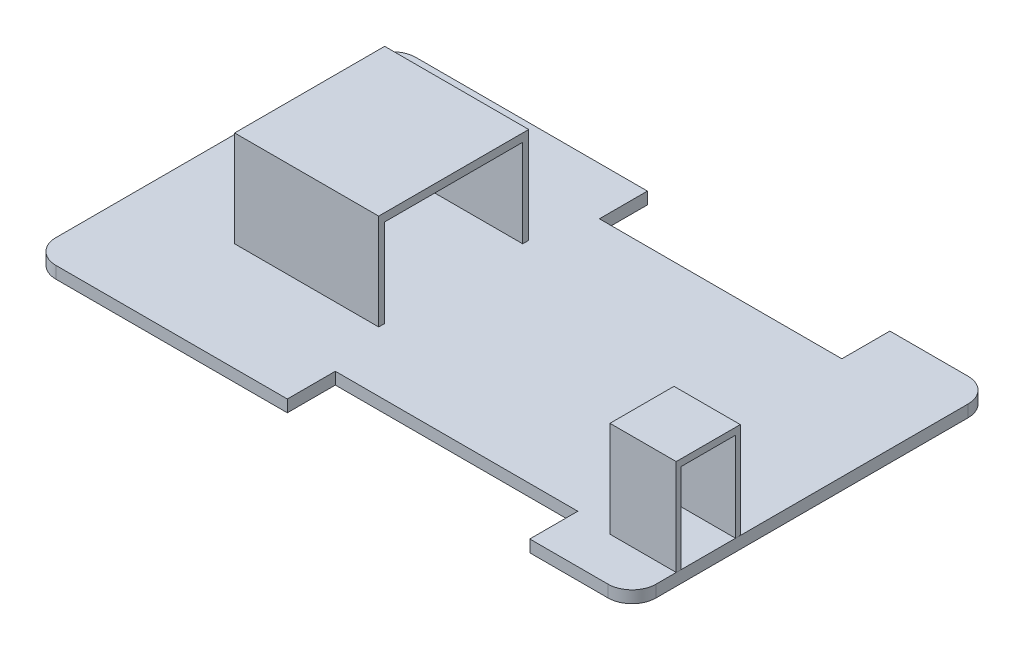
ISO-10303-21;
HEADER;
FILE_DESCRIPTION(('STEP AP214'),'2;1');
FILE_NAME('part.step','',(''),(''),'','','');
FILE_SCHEMA(('AUTOMOTIVE_DESIGN { 1 0 10303 214 1 1 1 1 }'));
ENDSEC;
DATA;
#1=APPLICATION_CONTEXT('core data for automotive mechanical design processes');
#2=APPLICATION_PROTOCOL_DEFINITION('international standard','automotive_design',2000,#1);
#3=PRODUCT_CONTEXT('',#1,'mechanical');
#4=PRODUCT('Part','Part','',(#3));
#5=PRODUCT_RELATED_PRODUCT_CATEGORY('part','',(#4));
#6=PRODUCT_DEFINITION_FORMATION('','',#4);
#7=PRODUCT_DEFINITION_CONTEXT('part definition',#1,'design');
#8=PRODUCT_DEFINITION('design','',#6,#7);
#9=PRODUCT_DEFINITION_SHAPE('','',#8);
#10=(LENGTH_UNIT() NAMED_UNIT(*) SI_UNIT(.MILLI.,.METRE.));
#11=(NAMED_UNIT(*) PLANE_ANGLE_UNIT() SI_UNIT($,.RADIAN.));
#12=(NAMED_UNIT(*) SI_UNIT($,.STERADIAN.) SOLID_ANGLE_UNIT());
#13=UNCERTAINTY_MEASURE_WITH_UNIT(LENGTH_MEASURE(1.E-05),#10,'distance_accuracy_value','');
#14=(GEOMETRIC_REPRESENTATION_CONTEXT(3) GLOBAL_UNCERTAINTY_ASSIGNED_CONTEXT((#13)) GLOBAL_UNIT_ASSIGNED_CONTEXT((#10,
#11,#12)) REPRESENTATION_CONTEXT('',''));
#15=CARTESIAN_POINT('',(0.,0.,0.));
#16=DIRECTION('',(0.,0.,1.));
#17=DIRECTION('',(1.,0.,0.));
#18=AXIS2_PLACEMENT_3D('',#15,#16,#17);
#19=CARTESIAN_POINT('',(99.4609846046097,45.,-47.5));
#20=DIRECTION('',(0.,0.,1.));
#21=DIRECTION('',(1.,0.,0.));
#22=AXIS2_PLACEMENT_3D('',#19,#20,#21);
#23=PLANE('',#22);
#24=DIRECTION('',(-1.,0.,0.));
#25=VECTOR('',#24,1.);
#26=CARTESIAN_POINT('',(99.4609846046097,41.6403706407777,-47.5));
#27=LINE('',#26,#25);
#28=CARTESIAN_POINT('',(99.4609846046097,41.6403706407777,-47.5));
#29=VERTEX_POINT('',#28);
#30=CARTESIAN_POINT('',(39.4609846046098,41.6403706407777,-47.5));
#31=VERTEX_POINT('',#30);
#32=EDGE_CURVE('E259',#29,#31,#27,.T.);
#33=ORIENTED_EDGE('',*,*,#32,.F.);
#34=DIRECTION('',(0.,-1.,0.));
#35=VECTOR('',#34,1.);
#36=CARTESIAN_POINT('',(99.4609846046097,45.,-47.5));
#37=LINE('',#36,#35);
#38=CARTESIAN_POINT('',(99.4609846046097,5.,-47.5));
#39=VERTEX_POINT('',#38);
#40=EDGE_CURVE('E268',#29,#39,#37,.T.);
#41=ORIENTED_EDGE('',*,*,#40,.T.);
#42=DIRECTION('',(-1.,0.,0.));
#43=VECTOR('',#42,1.);
#44=CARTESIAN_POINT('',(99.4609846046097,5.,-47.5));
#45=LINE('',#44,#43);
#46=CARTESIAN_POINT('',(39.4609846046098,5.,-47.5));
#47=VERTEX_POINT('',#46);
#48=EDGE_CURVE('E267',#39,#47,#45,.T.);
#49=ORIENTED_EDGE('',*,*,#48,.T.);
#50=DIRECTION('',(0.,-1.,0.));
#51=VECTOR('',#50,1.);
#52=CARTESIAN_POINT('',(39.4609846046098,45.,-47.5));
#53=LINE('',#52,#51);
#54=EDGE_CURVE('E248',#31,#47,#53,.T.);
#55=ORIENTED_EDGE('',*,*,#54,.F.);
#56=EDGE_LOOP('',(#33,#41,#49,#55));
#57=FACE_BOUND('',#56,.T.);
#58=ADVANCED_FACE('F33',(#57),#23,.F.);
#59=CARTESIAN_POINT('',(99.4609846046097,45.,-105.));
#60=DIRECTION('',(0.,0.,-1.));
#61=DIRECTION('',(-1.,0.,0.));
#62=AXIS2_PLACEMENT_3D('',#59,#60,#61);
#63=PLANE('',#62);
#64=DIRECTION('',(-1.,0.,0.));
#65=VECTOR('',#64,1.);
#66=CARTESIAN_POINT('',(99.4609846046097,41.6403706407777,-105.));
#67=LINE('',#66,#65);
#68=CARTESIAN_POINT('',(99.4609846046097,41.6403706407777,-105.));
#69=VERTEX_POINT('',#68);
#70=CARTESIAN_POINT('',(39.4609846046098,41.6403706407777,-105.));
#71=VERTEX_POINT('',#70);
#72=EDGE_CURVE('E256',#69,#71,#67,.T.);
#73=ORIENTED_EDGE('',*,*,#72,.T.);
#74=DIRECTION('',(0.,-1.,0.));
#75=VECTOR('',#74,1.);
#76=CARTESIAN_POINT('',(39.4609846046098,45.,-105.));
#77=LINE('',#76,#75);
#78=CARTESIAN_POINT('',(39.4609846046098,5.,-105.));
#79=VERTEX_POINT('',#78);
#80=EDGE_CURVE('E251',#71,#79,#77,.T.);
#81=ORIENTED_EDGE('',*,*,#80,.T.);
#82=DIRECTION('',(1.,0.,0.));
#83=VECTOR('',#82,1.);
#84=CARTESIAN_POINT('',(99.4609846046097,5.,-105.));
#85=LINE('',#84,#83);
#86=CARTESIAN_POINT('',(99.4609846046097,5.,-105.));
#87=VERTEX_POINT('',#86);
#88=EDGE_CURVE('E645',#79,#87,#85,.T.);
#89=ORIENTED_EDGE('',*,*,#88,.T.);
#90=DIRECTION('',(0.,-1.,0.));
#91=VECTOR('',#90,1.);
#92=CARTESIAN_POINT('',(99.4609846046097,45.,-105.));
#93=LINE('',#92,#91);
#94=EDGE_CURVE('E642',#69,#87,#93,.T.);
#95=ORIENTED_EDGE('',*,*,#94,.F.);
#96=EDGE_LOOP('',(#73,#81,#89,#95));
#97=FACE_BOUND('',#96,.T.);
#98=ADVANCED_FACE('F472',(#97),#63,.F.);
#99=CARTESIAN_POINT('',(249.98195246404,45.,-20.4156335925063));
#100=DIRECTION('',(0.,0.,1.));
#101=DIRECTION('',(1.,0.,0.));
#102=AXIS2_PLACEMENT_3D('',#99,#100,#101);
#103=PLANE('',#102);
#104=DIRECTION('',(1.,0.,0.));
#105=VECTOR('',#104,1.);
#106=CARTESIAN_POINT('',(222.381108480079,42.165895925109,-20.4156335925063));
#107=LINE('',#106,#105);
#108=CARTESIAN_POINT('',(222.381108480079,42.165895925109,-20.4156335925063));
#109=VERTEX_POINT('',#108);
#110=CARTESIAN_POINT('',(249.98195246404,42.165895925109,-20.4156335925063));
#111=VERTEX_POINT('',#110);
#112=EDGE_CURVE('E263',#109,#111,#107,.T.);
#113=ORIENTED_EDGE('',*,*,#112,.T.);
#114=DIRECTION('',(0.,-1.,0.));
#115=VECTOR('',#114,1.);
#116=CARTESIAN_POINT('',(249.98195246404,45.,-20.4156335925063));
#117=LINE('',#116,#115);
#118=CARTESIAN_POINT('',(249.98195246404,5.,-20.4156335925063));
#119=VERTEX_POINT('',#118);
#120=EDGE_CURVE('E328',#111,#119,#117,.T.);
#121=ORIENTED_EDGE('',*,*,#120,.T.);
#122=DIRECTION('',(-1.,0.,0.));
#123=VECTOR('',#122,1.);
#124=CARTESIAN_POINT('',(249.98195246404,5.,-20.4156335925063));
#125=LINE('',#124,#123);
#126=CARTESIAN_POINT('',(222.381108480079,5.,-20.4156335925063));
#127=VERTEX_POINT('',#126);
#128=EDGE_CURVE('E313',#119,#127,#125,.T.);
#129=ORIENTED_EDGE('',*,*,#128,.T.);
#130=DIRECTION('',(0.,-1.,0.));
#131=VECTOR('',#130,1.);
#132=CARTESIAN_POINT('',(222.381108480079,45.,-20.4156335925063));
#133=LINE('',#132,#131);
#134=EDGE_CURVE('E326',#109,#127,#133,.T.);
#135=ORIENTED_EDGE('',*,*,#134,.F.);
#136=EDGE_LOOP('',(#113,#121,#129,#135));
#137=FACE_BOUND('',#136,.T.);
#138=ADVANCED_FACE('F477',(#137),#103,.F.);
#139=CARTESIAN_POINT('',(249.98195246404,45.,-43.1069732205269));
#140=DIRECTION('',(0.,0.,-1.));
#141=DIRECTION('',(-1.,0.,0.));
#142=AXIS2_PLACEMENT_3D('',#139,#140,#141);
#143=PLANE('',#142);
#144=DIRECTION('',(1.,0.,0.));
#145=VECTOR('',#144,1.);
#146=CARTESIAN_POINT('',(222.381108480079,42.165895925109,-43.1069732205269));
#147=LINE('',#146,#145);
#148=CARTESIAN_POINT('',(222.381108480079,42.165895925109,-43.1069732205269));
#149=VERTEX_POINT('',#148);
#150=CARTESIAN_POINT('',(249.98195246404,42.165895925109,-43.1069732205269));
#151=VERTEX_POINT('',#150);
#152=EDGE_CURVE('E656',#149,#151,#147,.T.);
#153=ORIENTED_EDGE('',*,*,#152,.F.);
#154=DIRECTION('',(0.,-1.,0.));
#155=VECTOR('',#154,1.);
#156=CARTESIAN_POINT('',(222.381108480079,45.,-43.1069732205269));
#157=LINE('',#156,#155);
#158=CARTESIAN_POINT('',(222.381108480079,5.,-43.1069732205269));
#159=VERTEX_POINT('',#158);
#160=EDGE_CURVE('E294',#149,#159,#157,.T.);
#161=ORIENTED_EDGE('',*,*,#160,.T.);
#162=DIRECTION('',(1.,0.,0.));
#163=VECTOR('',#162,1.);
#164=CARTESIAN_POINT('',(249.98195246404,5.,-43.1069732205269));
#165=LINE('',#164,#163);
#166=CARTESIAN_POINT('',(249.98195246404,5.,-43.1069732205269));
#167=VERTEX_POINT('',#166);
#168=EDGE_CURVE('E282',#159,#167,#165,.T.);
#169=ORIENTED_EDGE('',*,*,#168,.T.);
#170=DIRECTION('',(0.,-1.,0.));
#171=VECTOR('',#170,1.);
#172=CARTESIAN_POINT('',(249.98195246404,45.,-43.1069732205269));
#173=LINE('',#172,#171);
#174=EDGE_CURVE('E281',#151,#167,#173,.T.);
#175=ORIENTED_EDGE('',*,*,#174,.F.);
#176=EDGE_LOOP('',(#153,#161,#169,#175));
#177=FACE_BOUND('',#176,.T.);
#178=ADVANCED_FACE('F488',(#177),#143,.F.);
#179=CARTESIAN_POINT('',(0.,5.,0.));
#180=DIRECTION('',(0.,-1.,0.));
#181=DIRECTION('',(0.,0.,-1.));
#182=AXIS2_PLACEMENT_3D('',#179,#180,#181);
#183=PLANE('',#182);
#184=DIRECTION('',(0.,0.,-1.));
#185=VECTOR('',#184,1.);
#186=CARTESIAN_POINT('',(99.4609846046097,5.,-47.5));
#187=LINE('',#186,#185);
#188=CARTESIAN_POINT('',(99.4609846046097,5.,-45.));
#189=VERTEX_POINT('',#188);
#190=EDGE_CURVE('E624',#189,#39,#187,.T.);
#191=ORIENTED_EDGE('',*,*,#190,.F.);
#192=DIRECTION('',(1.,0.,0.));
#193=VECTOR('',#192,1.);
#194=CARTESIAN_POINT('',(99.4609846046097,5.,-45.));
#195=LINE('',#194,#193);
#196=CARTESIAN_POINT('',(39.4609846046098,5.,-45.));
#197=VERTEX_POINT('',#196);
#198=EDGE_CURVE('E615',#197,#189,#195,.T.);
#199=ORIENTED_EDGE('',*,*,#198,.F.);
#200=DIRECTION('',(0.,0.,1.));
#201=VECTOR('',#200,1.);
#202=CARTESIAN_POINT('',(39.4609846046098,5.,-47.5));
#203=LINE('',#202,#201);
#204=EDGE_CURVE('E621',#47,#197,#203,.T.);
#205=ORIENTED_EDGE('',*,*,#204,.F.);
#206=ORIENTED_EDGE('',*,*,#48,.F.);
#207=EDGE_LOOP('',(#191,#199,#205,#206));
#208=FACE_BOUND('',#207,.T.);
#209=DIRECTION('',(0.,0.,-1.));
#210=VECTOR('',#209,1.);
#211=CARTESIAN_POINT('',(249.98195246404,5.,-20.4156335925063));
#212=LINE('',#211,#210);
#213=CARTESIAN_POINT('',(249.98195246404,5.,-18.4156335925063));
#214=VERTEX_POINT('',#213);
#215=EDGE_CURVE('E302',#214,#119,#212,.T.);
#216=ORIENTED_EDGE('',*,*,#215,.F.);
#217=DIRECTION('',(1.,0.,0.));
#218=VECTOR('',#217,1.);
#219=CARTESIAN_POINT('',(249.98195246404,5.,-18.4156335925063));
#220=LINE('',#219,#218);
#221=CARTESIAN_POINT('',(222.381108480079,5.,-18.4156335925063));
#222=VERTEX_POINT('',#221);
#223=EDGE_CURVE('E306',#222,#214,#220,.T.);
#224=ORIENTED_EDGE('',*,*,#223,.F.);
#225=DIRECTION('',(0.,0.,1.));
#226=VECTOR('',#225,1.);
#227=CARTESIAN_POINT('',(222.381108480079,5.,-20.4156335925063));
#228=LINE('',#227,#226);
#229=EDGE_CURVE('E316',#127,#222,#228,.T.);
#230=ORIENTED_EDGE('',*,*,#229,.F.);
#231=ORIENTED_EDGE('',*,*,#128,.F.);
#232=EDGE_LOOP('',(#216,#224,#230,#231));
#233=FACE_BOUND('',#232,.T.);
#234=DIRECTION('',(1.,0.,0.));
#235=VECTOR('',#234,1.);
#236=CARTESIAN_POINT('',(207.407471576062,5.,0.));
#237=LINE('',#236,#235);
#238=CARTESIAN_POINT('',(207.407471576062,5.,0.));
#239=VERTEX_POINT('',#238);
#240=CARTESIAN_POINT('',(240.,5.,0.));
#241=VERTEX_POINT('',#240);
#242=EDGE_CURVE('E343',#239,#241,#237,.T.);
#243=ORIENTED_EDGE('',*,*,#242,.T.);
#244=CARTESIAN_POINT('',(240.,5.,-10.));
#245=DIRECTION('',(0.,-1.,0.));
#246=DIRECTION('',(0.,0.,-1.));
#247=AXIS2_PLACEMENT_3D('',#244,#245,#246);
#248=CIRCLE('',#247,10.);
#249=CARTESIAN_POINT('',(250.,5.,-10.));
#250=VERTEX_POINT('',#249);
#251=EDGE_CURVE('E427',#241,#250,#248,.F.);
#252=ORIENTED_EDGE('',*,*,#251,.T.);
#253=DIRECTION('',(0.,0.,-1.));
#254=VECTOR('',#253,1.);
#255=CARTESIAN_POINT('',(250.,5.,0.));
#256=LINE('',#255,#254);
#257=CARTESIAN_POINT('',(250.,5.,-140.));
#258=VERTEX_POINT('',#257);
#259=EDGE_CURVE('E346',#250,#258,#256,.T.);
#260=ORIENTED_EDGE('',*,*,#259,.T.);
#261=CARTESIAN_POINT('',(240.,5.,-140.));
#262=DIRECTION('',(0.,-1.,0.));
#263=DIRECTION('',(0.,0.,-1.));
#264=AXIS2_PLACEMENT_3D('',#261,#262,#263);
#265=CIRCLE('',#264,10.);
#266=CARTESIAN_POINT('',(240.,5.,-150.));
#267=VERTEX_POINT('',#266);
#268=EDGE_CURVE('E55',#258,#267,#265,.F.);
#269=ORIENTED_EDGE('',*,*,#268,.T.);
#270=DIRECTION('',(-1.,0.,0.));
#271=VECTOR('',#270,1.);
#272=CARTESIAN_POINT('',(207.407471576062,5.,-150.));
#273=LINE('',#272,#271);
#274=CARTESIAN_POINT('',(207.407471576062,5.,-150.));
#275=VERTEX_POINT('',#274);
#276=EDGE_CURVE('E348',#267,#275,#273,.T.);
#277=ORIENTED_EDGE('',*,*,#276,.T.);
#278=DIRECTION('',(0.,0.,1.));
#279=VECTOR('',#278,1.);
#280=CARTESIAN_POINT('',(207.407471576062,5.,-150.));
#281=LINE('',#280,#279);
#282=CARTESIAN_POINT('',(207.407471576062,5.,-130.));
#283=VERTEX_POINT('',#282);
#284=EDGE_CURVE('E350',#275,#283,#281,.T.);
#285=ORIENTED_EDGE('',*,*,#284,.T.);
#286=DIRECTION('',(-1.,0.,0.));
#287=VECTOR('',#286,1.);
#288=CARTESIAN_POINT('',(106.407471576062,5.,-130.));
#289=LINE('',#288,#287);
#290=CARTESIAN_POINT('',(106.407471576062,5.,-130.));
#291=VERTEX_POINT('',#290);
#292=EDGE_CURVE('E352',#283,#291,#289,.T.);
#293=ORIENTED_EDGE('',*,*,#292,.T.);
#294=DIRECTION('',(0.,0.,-1.));
#295=VECTOR('',#294,1.);
#296=CARTESIAN_POINT('',(106.407471576062,5.,-150.));
#297=LINE('',#296,#295);
#298=CARTESIAN_POINT('',(106.407471576062,5.,-150.));
#299=VERTEX_POINT('',#298);
#300=EDGE_CURVE('E354',#291,#299,#297,.T.);
#301=ORIENTED_EDGE('',*,*,#300,.T.);
#302=DIRECTION('',(-1.,0.,0.));
#303=VECTOR('',#302,1.);
#304=CARTESIAN_POINT('',(0.,5.,-150.));
#305=LINE('',#304,#303);
#306=CARTESIAN_POINT('',(10.,5.,-150.));
#307=VERTEX_POINT('',#306);
#308=EDGE_CURVE('E356',#299,#307,#305,.T.);
#309=ORIENTED_EDGE('',*,*,#308,.T.);
#310=CARTESIAN_POINT('',(10.,5.,-140.));
#311=DIRECTION('',(0.,-1.,0.));
#312=DIRECTION('',(0.,0.,-1.));
#313=AXIS2_PLACEMENT_3D('',#310,#311,#312);
#314=CIRCLE('',#313,10.);
#315=CARTESIAN_POINT('',(0.,5.,-140.));
#316=VERTEX_POINT('',#315);
#317=EDGE_CURVE('E424',#307,#316,#314,.F.);
#318=ORIENTED_EDGE('',*,*,#317,.T.);
#319=DIRECTION('',(0.,0.,1.));
#320=VECTOR('',#319,1.);
#321=CARTESIAN_POINT('',(0.,5.,0.));
#322=LINE('',#321,#320);
#323=CARTESIAN_POINT('',(0.,5.,-10.));
#324=VERTEX_POINT('',#323);
#325=EDGE_CURVE('E331',#316,#324,#322,.T.);
#326=ORIENTED_EDGE('',*,*,#325,.T.);
#327=CARTESIAN_POINT('',(10.,5.,-10.));
#328=DIRECTION('',(0.,-1.,0.));
#329=DIRECTION('',(0.,0.,-1.));
#330=AXIS2_PLACEMENT_3D('',#327,#328,#329);
#331=CIRCLE('',#330,10.);
#332=CARTESIAN_POINT('',(10.,5.,0.));
#333=VERTEX_POINT('',#332);
#334=EDGE_CURVE('E422',#324,#333,#331,.F.);
#335=ORIENTED_EDGE('',*,*,#334,.T.);
#336=DIRECTION('',(1.,0.,0.));
#337=VECTOR('',#336,1.);
#338=CARTESIAN_POINT('',(0.,5.,0.));
#339=LINE('',#338,#337);
#340=CARTESIAN_POINT('',(106.407471576062,5.,0.));
#341=VERTEX_POINT('',#340);
#342=EDGE_CURVE('E334',#333,#341,#339,.T.);
#343=ORIENTED_EDGE('',*,*,#342,.T.);
#344=DIRECTION('',(0.,0.,-1.));
#345=VECTOR('',#344,1.);
#346=CARTESIAN_POINT('',(106.407471576062,5.,-20.));
#347=LINE('',#346,#345);
#348=CARTESIAN_POINT('',(106.407471576062,5.,-20.));
#349=VERTEX_POINT('',#348);
#350=EDGE_CURVE('E337',#341,#349,#347,.T.);
#351=ORIENTED_EDGE('',*,*,#350,.T.);
#352=DIRECTION('',(1.,0.,0.));
#353=VECTOR('',#352,1.);
#354=CARTESIAN_POINT('',(106.407471576062,5.,-20.));
#355=LINE('',#354,#353);
#356=CARTESIAN_POINT('',(207.407471576062,5.,-20.));
#357=VERTEX_POINT('',#356);
#358=EDGE_CURVE('E339',#349,#357,#355,.T.);
#359=ORIENTED_EDGE('',*,*,#358,.T.);
#360=DIRECTION('',(0.,0.,1.));
#361=VECTOR('',#360,1.);
#362=CARTESIAN_POINT('',(207.407471576062,5.,-20.));
#363=LINE('',#362,#361);
#364=EDGE_CURVE('E341',#357,#239,#363,.T.);
#365=ORIENTED_EDGE('',*,*,#364,.T.);
#366=EDGE_LOOP('',(#243,#252,#260,#269,#277,#285,#293,#301,#309,#318,#326,#335,#343,#351,#359,#365));
#367=FACE_BOUND('',#366,.T.);
#368=DIRECTION('',(0.,0.,-1.));
#369=VECTOR('',#368,1.);
#370=CARTESIAN_POINT('',(249.98195246404,5.,-45.1069732205269));
#371=LINE('',#370,#369);
#372=CARTESIAN_POINT('',(249.98195246404,5.,-45.1069732205269));
#373=VERTEX_POINT('',#372);
#374=EDGE_CURVE('E271',#167,#373,#371,.T.);
#375=ORIENTED_EDGE('',*,*,#374,.F.);
#376=ORIENTED_EDGE('',*,*,#168,.F.);
#377=DIRECTION('',(0.,0.,1.));
#378=VECTOR('',#377,1.);
#379=CARTESIAN_POINT('',(222.381108480079,5.,-45.1069732205269));
#380=LINE('',#379,#378);
#381=CARTESIAN_POINT('',(222.381108480079,5.,-45.1069732205269));
#382=VERTEX_POINT('',#381);
#383=EDGE_CURVE('E288',#382,#159,#380,.T.);
#384=ORIENTED_EDGE('',*,*,#383,.F.);
#385=DIRECTION('',(-1.,0.,0.));
#386=VECTOR('',#385,1.);
#387=CARTESIAN_POINT('',(249.98195246404,5.,-45.1069732205269));
#388=LINE('',#387,#386);
#389=EDGE_CURVE('E285',#373,#382,#388,.T.);
#390=ORIENTED_EDGE('',*,*,#389,.F.);
#391=EDGE_LOOP('',(#375,#376,#384,#390));
#392=FACE_BOUND('',#391,.T.);
#393=DIRECTION('',(0.,0.,-1.));
#394=VECTOR('',#393,1.);
#395=CARTESIAN_POINT('',(99.4609846046097,5.,-105.));
#396=LINE('',#395,#394);
#397=CARTESIAN_POINT('',(99.4609846046097,5.,-107.5));
#398=VERTEX_POINT('',#397);
#399=EDGE_CURVE('E653',#87,#398,#396,.T.);
#400=ORIENTED_EDGE('',*,*,#399,.F.);
#401=ORIENTED_EDGE('',*,*,#88,.F.);
#402=DIRECTION('',(0.,0.,1.));
#403=VECTOR('',#402,1.);
#404=CARTESIAN_POINT('',(39.4609846046098,5.,-105.));
#405=LINE('',#404,#403);
#406=CARTESIAN_POINT('',(39.4609846046098,5.,-107.5));
#407=VERTEX_POINT('',#406);
#408=EDGE_CURVE('E648',#407,#79,#405,.T.);
#409=ORIENTED_EDGE('',*,*,#408,.F.);
#410=DIRECTION('',(-1.,0.,0.));
#411=VECTOR('',#410,1.);
#412=CARTESIAN_POINT('',(99.4609846046097,5.,-107.5));
#413=LINE('',#412,#411);
#414=EDGE_CURVE('E650',#398,#407,#413,.T.);
#415=ORIENTED_EDGE('',*,*,#414,.F.);
#416=EDGE_LOOP('',(#400,#401,#409,#415));
#417=FACE_BOUND('',#416,.T.);
#418=ADVANCED_FACE('F458',(#208,#233,#367,#392,#417),#183,.F.);
#419=CARTESIAN_POINT('',(0.,5.,0.));
#420=DIRECTION('',(1.,0.,0.));
#421=DIRECTION('',(0.,0.,-1.));
#422=AXIS2_PLACEMENT_3D('',#419,#420,#421);
#423=PLANE('',#422);
#424=ORIENTED_EDGE('',*,*,#325,.F.);
#425=DIRECTION('',(0.,-1.,0.));
#426=VECTOR('',#425,1.);
#427=CARTESIAN_POINT('',(0.,5.,-140.));
#428=LINE('',#427,#426);
#429=CARTESIAN_POINT('',(0.,0.,-140.));
#430=VERTEX_POINT('',#429);
#431=EDGE_CURVE('E434',#316,#430,#428,.T.);
#432=ORIENTED_EDGE('',*,*,#431,.T.);
#433=DIRECTION('',(0.,0.,1.));
#434=VECTOR('',#433,1.);
#435=CARTESIAN_POINT('',(0.,0.,0.));
#436=LINE('',#435,#434);
#437=CARTESIAN_POINT('',(0.,0.,-10.));
#438=VERTEX_POINT('',#437);
#439=EDGE_CURVE('E330',#430,#438,#436,.T.);
#440=ORIENTED_EDGE('',*,*,#439,.T.);
#441=DIRECTION('',(0.,-1.,0.));
#442=VECTOR('',#441,1.);
#443=CARTESIAN_POINT('',(0.,5.,-10.));
#444=LINE('',#443,#442);
#445=EDGE_CURVE('E432',#438,#324,#444,.F.);
#446=ORIENTED_EDGE('',*,*,#445,.T.);
#447=EDGE_LOOP('',(#424,#432,#440,#446));
#448=FACE_BOUND('',#447,.T.);
#449=ADVANCED_FACE('F440',(#448),#423,.F.);
#450=CARTESIAN_POINT('',(0.,5.,0.));
#451=DIRECTION('',(0.,0.,-1.));
#452=DIRECTION('',(-1.,0.,0.));
#453=AXIS2_PLACEMENT_3D('',#450,#451,#452);
#454=PLANE('',#453);
#455=ORIENTED_EDGE('',*,*,#342,.F.);
#456=DIRECTION('',(0.,-1.,0.));
#457=VECTOR('',#456,1.);
#458=CARTESIAN_POINT('',(10.,5.,0.));
#459=LINE('',#458,#457);
#460=CARTESIAN_POINT('',(10.,0.,0.));
#461=VERTEX_POINT('',#460);
#462=EDGE_CURVE('E11',#333,#461,#459,.T.);
#463=ORIENTED_EDGE('',*,*,#462,.T.);
#464=DIRECTION('',(1.,0.,0.));
#465=VECTOR('',#464,1.);
#466=CARTESIAN_POINT('',(0.,0.,0.));
#467=LINE('',#466,#465);
#468=CARTESIAN_POINT('',(106.407471576062,0.,0.));
#469=VERTEX_POINT('',#468);
#470=EDGE_CURVE('E361',#461,#469,#467,.T.);
#471=ORIENTED_EDGE('',*,*,#470,.T.);
#472=DIRECTION('',(0.,-1.,0.));
#473=VECTOR('',#472,1.);
#474=CARTESIAN_POINT('',(106.407471576062,5.,0.));
#475=LINE('',#474,#473);
#476=EDGE_CURVE('E404',#341,#469,#475,.T.);
#477=ORIENTED_EDGE('',*,*,#476,.F.);
#478=EDGE_LOOP('',(#455,#463,#471,#477));
#479=FACE_BOUND('',#478,.T.);
#480=ADVANCED_FACE('F455',(#479),#454,.F.);
#481=CARTESIAN_POINT('',(106.407471576062,5.,-20.));
#482=DIRECTION('',(-1.,0.,0.));
#483=DIRECTION('',(0.,0.,1.));
#484=AXIS2_PLACEMENT_3D('',#481,#482,#483);
#485=PLANE('',#484);
#486=DIRECTION('',(0.,0.,-1.));
#487=VECTOR('',#486,1.);
#488=CARTESIAN_POINT('',(106.407471576062,0.,-20.));
#489=LINE('',#488,#487);
#490=CARTESIAN_POINT('',(106.407471576062,0.,-20.));
#491=VERTEX_POINT('',#490);
#492=EDGE_CURVE('E363',#469,#491,#489,.T.);
#493=ORIENTED_EDGE('',*,*,#492,.T.);
#494=DIRECTION('',(0.,-1.,0.));
#495=VECTOR('',#494,1.);
#496=CARTESIAN_POINT('',(106.407471576062,5.,-20.));
#497=LINE('',#496,#495);
#498=EDGE_CURVE('E401',#349,#491,#497,.T.);
#499=ORIENTED_EDGE('',*,*,#498,.F.);
#500=ORIENTED_EDGE('',*,*,#350,.F.);
#501=ORIENTED_EDGE('',*,*,#476,.T.);
#502=EDGE_LOOP('',(#493,#499,#500,#501));
#503=FACE_BOUND('',#502,.T.);
#504=ADVANCED_FACE('F553',(#503),#485,.F.);
#505=CARTESIAN_POINT('',(106.407471576062,5.,-20.));
#506=DIRECTION('',(0.,0.,-1.));
#507=DIRECTION('',(-1.,0.,0.));
#508=AXIS2_PLACEMENT_3D('',#505,#506,#507);
#509=PLANE('',#508);
#510=DIRECTION('',(1.,0.,0.));
#511=VECTOR('',#510,1.);
#512=CARTESIAN_POINT('',(106.407471576062,0.,-20.));
#513=LINE('',#512,#511);
#514=CARTESIAN_POINT('',(207.407471576062,0.,-20.));
#515=VERTEX_POINT('',#514);
#516=EDGE_CURVE('E365',#491,#515,#513,.T.);
#517=ORIENTED_EDGE('',*,*,#516,.T.);
#518=DIRECTION('',(0.,-1.,0.));
#519=VECTOR('',#518,1.);
#520=CARTESIAN_POINT('',(207.407471576062,5.,-20.));
#521=LINE('',#520,#519);
#522=EDGE_CURVE('E398',#357,#515,#521,.T.);
#523=ORIENTED_EDGE('',*,*,#522,.F.);
#524=ORIENTED_EDGE('',*,*,#358,.F.);
#525=ORIENTED_EDGE('',*,*,#498,.T.);
#526=EDGE_LOOP('',(#517,#523,#524,#525));
#527=FACE_BOUND('',#526,.T.);
#528=ADVANCED_FACE('F549',(#527),#509,.F.);
#529=CARTESIAN_POINT('',(207.407471576062,5.,-20.));
#530=DIRECTION('',(1.,0.,0.));
#531=DIRECTION('',(0.,0.,-1.));
#532=AXIS2_PLACEMENT_3D('',#529,#530,#531);
#533=PLANE('',#532);
#534=DIRECTION('',(0.,0.,1.));
#535=VECTOR('',#534,1.);
#536=CARTESIAN_POINT('',(207.407471576062,0.,-20.));
#537=LINE('',#536,#535);
#538=CARTESIAN_POINT('',(207.407471576062,0.,0.));
#539=VERTEX_POINT('',#538);
#540=EDGE_CURVE('E367',#515,#539,#537,.T.);
#541=ORIENTED_EDGE('',*,*,#540,.T.);
#542=DIRECTION('',(0.,-1.,0.));
#543=VECTOR('',#542,1.);
#544=CARTESIAN_POINT('',(207.407471576062,5.,0.));
#545=LINE('',#544,#543);
#546=EDGE_CURVE('E395',#239,#539,#545,.T.);
#547=ORIENTED_EDGE('',*,*,#546,.F.);
#548=ORIENTED_EDGE('',*,*,#364,.F.);
#549=ORIENTED_EDGE('',*,*,#522,.T.);
#550=EDGE_LOOP('',(#541,#547,#548,#549));
#551=FACE_BOUND('',#550,.T.);
#552=ADVANCED_FACE('F545',(#551),#533,.F.);
#553=CARTESIAN_POINT('',(207.407471576062,5.,0.));
#554=DIRECTION('',(0.,0.,-1.));
#555=DIRECTION('',(-1.,0.,0.));
#556=AXIS2_PLACEMENT_3D('',#553,#554,#555);
#557=PLANE('',#556);
#558=DIRECTION('',(1.,0.,0.));
#559=VECTOR('',#558,1.);
#560=CARTESIAN_POINT('',(207.407471576062,0.,0.));
#561=LINE('',#560,#559);
#562=CARTESIAN_POINT('',(240.,0.,0.));
#563=VERTEX_POINT('',#562);
#564=EDGE_CURVE('E369',#539,#563,#561,.T.);
#565=ORIENTED_EDGE('',*,*,#564,.T.);
#566=DIRECTION('',(0.,-1.,0.));
#567=VECTOR('',#566,1.);
#568=CARTESIAN_POINT('',(240.,5.,0.));
#569=LINE('',#568,#567);
#570=EDGE_CURVE('E420',#563,#241,#569,.F.);
#571=ORIENTED_EDGE('',*,*,#570,.T.);
#572=ORIENTED_EDGE('',*,*,#242,.F.);
#573=ORIENTED_EDGE('',*,*,#546,.T.);
#574=EDGE_LOOP('',(#565,#571,#572,#573));
#575=FACE_BOUND('',#574,.T.);
#576=ADVANCED_FACE('F541',(#575),#557,.F.);
#577=CARTESIAN_POINT('',(250.,5.,0.));
#578=DIRECTION('',(-1.,0.,0.));
#579=DIRECTION('',(0.,0.,1.));
#580=AXIS2_PLACEMENT_3D('',#577,#578,#579);
#581=PLANE('',#580);
#582=ORIENTED_EDGE('',*,*,#259,.F.);
#583=DIRECTION('',(0.,-1.,0.));
#584=VECTOR('',#583,1.);
#585=CARTESIAN_POINT('',(250.,5.,-10.));
#586=LINE('',#585,#584);
#587=CARTESIAN_POINT('',(250.,0.,-10.));
#588=VERTEX_POINT('',#587);
#589=EDGE_CURVE('E409',#250,#588,#586,.T.);
#590=ORIENTED_EDGE('',*,*,#589,.T.);
#591=DIRECTION('',(0.,0.,-1.));
#592=VECTOR('',#591,1.);
#593=CARTESIAN_POINT('',(250.,0.,0.));
#594=LINE('',#593,#592);
#595=CARTESIAN_POINT('',(250.,0.,-140.));
#596=VERTEX_POINT('',#595);
#597=EDGE_CURVE('E372',#588,#596,#594,.T.);
#598=ORIENTED_EDGE('',*,*,#597,.T.);
#599=DIRECTION('',(0.,-1.,0.));
#600=VECTOR('',#599,1.);
#601=CARTESIAN_POINT('',(250.,5.,-140.));
#602=LINE('',#601,#600);
#603=EDGE_CURVE('E407',#596,#258,#602,.F.);
#604=ORIENTED_EDGE('',*,*,#603,.T.);
#605=EDGE_LOOP('',(#582,#590,#598,#604));
#606=FACE_BOUND('',#605,.T.);
#607=ADVANCED_FACE('F537',(#606),#581,.F.);
#608=CARTESIAN_POINT('',(207.407471576062,5.,-150.));
#609=DIRECTION('',(0.,0.,1.));
#610=DIRECTION('',(1.,0.,0.));
#611=AXIS2_PLACEMENT_3D('',#608,#609,#610);
#612=PLANE('',#611);
#613=ORIENTED_EDGE('',*,*,#276,.F.);
#614=DIRECTION('',(0.,-1.,0.));
#615=VECTOR('',#614,1.);
#616=CARTESIAN_POINT('',(240.,5.,-150.));
#617=LINE('',#616,#615);
#618=CARTESIAN_POINT('',(240.,0.,-150.));
#619=VERTEX_POINT('',#618);
#620=EDGE_CURVE('E429',#267,#619,#617,.T.);
#621=ORIENTED_EDGE('',*,*,#620,.T.);
#622=DIRECTION('',(-1.,0.,0.));
#623=VECTOR('',#622,1.);
#624=CARTESIAN_POINT('',(207.407471576062,0.,-150.));
#625=LINE('',#624,#623);
#626=CARTESIAN_POINT('',(207.407471576062,0.,-150.));
#627=VERTEX_POINT('',#626);
#628=EDGE_CURVE('E375',#619,#627,#625,.T.);
#629=ORIENTED_EDGE('',*,*,#628,.T.);
#630=DIRECTION('',(0.,-1.,0.));
#631=VECTOR('',#630,1.);
#632=CARTESIAN_POINT('',(207.407471576062,5.,-150.));
#633=LINE('',#632,#631);
#634=EDGE_CURVE('E392',#275,#627,#633,.T.);
#635=ORIENTED_EDGE('',*,*,#634,.F.);
#636=EDGE_LOOP('',(#613,#621,#629,#635));
#637=FACE_BOUND('',#636,.T.);
#638=ADVANCED_FACE('F533',(#637),#612,.F.);
#639=CARTESIAN_POINT('',(207.407471576062,5.,-150.));
#640=DIRECTION('',(1.,0.,0.));
#641=DIRECTION('',(0.,0.,-1.));
#642=AXIS2_PLACEMENT_3D('',#639,#640,#641);
#643=PLANE('',#642);
#644=DIRECTION('',(0.,0.,1.));
#645=VECTOR('',#644,1.);
#646=CARTESIAN_POINT('',(207.407471576062,0.,-150.));
#647=LINE('',#646,#645);
#648=CARTESIAN_POINT('',(207.407471576062,0.,-130.));
#649=VERTEX_POINT('',#648);
#650=EDGE_CURVE('E377',#627,#649,#647,.T.);
#651=ORIENTED_EDGE('',*,*,#650,.T.);
#652=DIRECTION('',(0.,-1.,0.));
#653=VECTOR('',#652,1.);
#654=CARTESIAN_POINT('',(207.407471576062,5.,-130.));
#655=LINE('',#654,#653);
#656=EDGE_CURVE('E389',#283,#649,#655,.T.);
#657=ORIENTED_EDGE('',*,*,#656,.F.);
#658=ORIENTED_EDGE('',*,*,#284,.F.);
#659=ORIENTED_EDGE('',*,*,#634,.T.);
#660=EDGE_LOOP('',(#651,#657,#658,#659));
#661=FACE_BOUND('',#660,.T.);
#662=ADVANCED_FACE('F529',(#661),#643,.F.);
#663=CARTESIAN_POINT('',(106.407471576062,5.,-130.));
#664=DIRECTION('',(0.,0.,1.));
#665=DIRECTION('',(1.,0.,0.));
#666=AXIS2_PLACEMENT_3D('',#663,#664,#665);
#667=PLANE('',#666);
#668=DIRECTION('',(-1.,0.,0.));
#669=VECTOR('',#668,1.);
#670=CARTESIAN_POINT('',(106.407471576062,0.,-130.));
#671=LINE('',#670,#669);
#672=CARTESIAN_POINT('',(106.407471576062,0.,-130.));
#673=VERTEX_POINT('',#672);
#674=EDGE_CURVE('E379',#649,#673,#671,.T.);
#675=ORIENTED_EDGE('',*,*,#674,.T.);
#676=DIRECTION('',(0.,-1.,0.));
#677=VECTOR('',#676,1.);
#678=CARTESIAN_POINT('',(106.407471576062,5.,-130.));
#679=LINE('',#678,#677);
#680=EDGE_CURVE('E386',#291,#673,#679,.T.);
#681=ORIENTED_EDGE('',*,*,#680,.F.);
#682=ORIENTED_EDGE('',*,*,#292,.F.);
#683=ORIENTED_EDGE('',*,*,#656,.T.);
#684=EDGE_LOOP('',(#675,#681,#682,#683));
#685=FACE_BOUND('',#684,.T.);
#686=ADVANCED_FACE('F525',(#685),#667,.F.);
#687=CARTESIAN_POINT('',(106.407471576062,5.,-150.));
#688=DIRECTION('',(-1.,0.,0.));
#689=DIRECTION('',(0.,0.,1.));
#690=AXIS2_PLACEMENT_3D('',#687,#688,#689);
#691=PLANE('',#690);
#692=DIRECTION('',(0.,0.,-1.));
#693=VECTOR('',#692,1.);
#694=CARTESIAN_POINT('',(106.407471576062,0.,-150.));
#695=LINE('',#694,#693);
#696=CARTESIAN_POINT('',(106.407471576062,0.,-150.));
#697=VERTEX_POINT('',#696);
#698=EDGE_CURVE('E381',#673,#697,#695,.T.);
#699=ORIENTED_EDGE('',*,*,#698,.T.);
#700=DIRECTION('',(0.,-1.,0.));
#701=VECTOR('',#700,1.);
#702=CARTESIAN_POINT('',(106.407471576062,5.,-150.));
#703=LINE('',#702,#701);
#704=EDGE_CURVE('E358',#299,#697,#703,.T.);
#705=ORIENTED_EDGE('',*,*,#704,.F.);
#706=ORIENTED_EDGE('',*,*,#300,.F.);
#707=ORIENTED_EDGE('',*,*,#680,.T.);
#708=EDGE_LOOP('',(#699,#705,#706,#707));
#709=FACE_BOUND('',#708,.T.);
#710=ADVANCED_FACE('F522',(#709),#691,.F.);
#711=CARTESIAN_POINT('',(0.,5.,-150.));
#712=DIRECTION('',(0.,0.,1.));
#713=DIRECTION('',(1.,0.,0.));
#714=AXIS2_PLACEMENT_3D('',#711,#712,#713);
#715=PLANE('',#714);
#716=DIRECTION('',(-1.,0.,0.));
#717=VECTOR('',#716,1.);
#718=CARTESIAN_POINT('',(0.,0.,-150.));
#719=LINE('',#718,#717);
#720=CARTESIAN_POINT('',(10.,0.,-150.));
#721=VERTEX_POINT('',#720);
#722=EDGE_CURVE('E335',#697,#721,#719,.T.);
#723=ORIENTED_EDGE('',*,*,#722,.T.);
#724=DIRECTION('',(0.,-1.,0.));
#725=VECTOR('',#724,1.);
#726=CARTESIAN_POINT('',(10.,5.,-150.));
#727=LINE('',#726,#725);
#728=EDGE_CURVE('E41',#721,#307,#727,.F.);
#729=ORIENTED_EDGE('',*,*,#728,.T.);
#730=ORIENTED_EDGE('',*,*,#308,.F.);
#731=ORIENTED_EDGE('',*,*,#704,.T.);
#732=EDGE_LOOP('',(#723,#729,#730,#731));
#733=FACE_BOUND('',#732,.T.);
#734=ADVANCED_FACE('F519',(#733),#715,.F.);
#735=CARTESIAN_POINT('',(0.,0.,0.));
#736=DIRECTION('',(0.,-1.,0.));
#737=DIRECTION('',(0.,0.,-1.));
#738=AXIS2_PLACEMENT_3D('',#735,#736,#737);
#739=PLANE('',#738);
#740=ORIENTED_EDGE('',*,*,#597,.F.);
#741=CARTESIAN_POINT('',(240.,0.,-10.));
#742=DIRECTION('',(0.,-1.,0.));
#743=DIRECTION('',(0.,0.,-1.));
#744=AXIS2_PLACEMENT_3D('',#741,#742,#743);
#745=CIRCLE('',#744,10.);
#746=EDGE_CURVE('E418',#588,#563,#745,.T.);
#747=ORIENTED_EDGE('',*,*,#746,.T.);
#748=ORIENTED_EDGE('',*,*,#564,.F.);
#749=ORIENTED_EDGE('',*,*,#540,.F.);
#750=ORIENTED_EDGE('',*,*,#516,.F.);
#751=ORIENTED_EDGE('',*,*,#492,.F.);
#752=ORIENTED_EDGE('',*,*,#470,.F.);
#753=CARTESIAN_POINT('',(10.,0.,-10.));
#754=DIRECTION('',(0.,-1.,0.));
#755=DIRECTION('',(0.,0.,-1.));
#756=AXIS2_PLACEMENT_3D('',#753,#754,#755);
#757=CIRCLE('',#756,10.);
#758=EDGE_CURVE('E412',#461,#438,#757,.T.);
#759=ORIENTED_EDGE('',*,*,#758,.T.);
#760=ORIENTED_EDGE('',*,*,#439,.F.);
#761=CARTESIAN_POINT('',(10.,0.,-140.));
#762=DIRECTION('',(0.,-1.,0.));
#763=DIRECTION('',(0.,0.,-1.));
#764=AXIS2_PLACEMENT_3D('',#761,#762,#763);
#765=CIRCLE('',#764,10.);
#766=EDGE_CURVE('E414',#430,#721,#765,.T.);
#767=ORIENTED_EDGE('',*,*,#766,.T.);
#768=ORIENTED_EDGE('',*,*,#722,.F.);
#769=ORIENTED_EDGE('',*,*,#698,.F.);
#770=ORIENTED_EDGE('',*,*,#674,.F.);
#771=ORIENTED_EDGE('',*,*,#650,.F.);
#772=ORIENTED_EDGE('',*,*,#628,.F.);
#773=CARTESIAN_POINT('',(240.,0.,-140.));
#774=DIRECTION('',(0.,-1.,0.));
#775=DIRECTION('',(0.,0.,-1.));
#776=AXIS2_PLACEMENT_3D('',#773,#774,#775);
#777=CIRCLE('',#776,10.);
#778=EDGE_CURVE('E416',#619,#596,#777,.T.);
#779=ORIENTED_EDGE('',*,*,#778,.T.);
#780=EDGE_LOOP('',(#740,#747,#748,#749,#750,#751,#752,#759,#760,#767,#768,#769,#770,#771,#772,#779));
#781=FACE_BOUND('',#780,.T.);
#782=ADVANCED_FACE('F446',(#781),#739,.T.);
#783=CARTESIAN_POINT('',(249.98195246404,45.,-20.4156335925063));
#784=DIRECTION('',(-1.,0.,0.));
#785=DIRECTION('',(0.,0.,1.));
#786=AXIS2_PLACEMENT_3D('',#783,#784,#785);
#787=PLANE('',#786);
#788=ORIENTED_EDGE('',*,*,#215,.T.);
#789=ORIENTED_EDGE('',*,*,#120,.F.);
#790=DIRECTION('',(0.,0.,-1.));
#791=VECTOR('',#790,1.);
#792=CARTESIAN_POINT('',(249.98195246404,42.165895925109,7.33033430436619));
#793=LINE('',#792,#791);
#794=EDGE_CURVE('E659',#111,#151,#793,.T.);
#795=ORIENTED_EDGE('',*,*,#794,.T.);
#796=ORIENTED_EDGE('',*,*,#174,.T.);
#797=ORIENTED_EDGE('',*,*,#374,.T.);
#798=DIRECTION('',(0.,-1.,0.));
#799=VECTOR('',#798,1.);
#800=CARTESIAN_POINT('',(249.98195246404,45.,-45.1069732205269));
#801=LINE('',#800,#799);
#802=CARTESIAN_POINT('',(249.98195246404,45.,-45.1069732205269));
#803=VERTEX_POINT('',#802);
#804=EDGE_CURVE('E299',#803,#373,#801,.T.);
#805=ORIENTED_EDGE('',*,*,#804,.F.);
#806=DIRECTION('',(0.,0.,-1.));
#807=VECTOR('',#806,1.);
#808=CARTESIAN_POINT('',(249.98195246404,45.,-20.4156335925063));
#809=LINE('',#808,#807);
#810=CARTESIAN_POINT('',(249.98195246404,45.,-18.4156335925063));
#811=VERTEX_POINT('',#810);
#812=EDGE_CURVE('E303',#811,#803,#809,.T.);
#813=ORIENTED_EDGE('',*,*,#812,.F.);
#814=DIRECTION('',(0.,-1.,0.));
#815=VECTOR('',#814,1.);
#816=CARTESIAN_POINT('',(249.98195246404,45.,-18.4156335925063));
#817=LINE('',#816,#815);
#818=EDGE_CURVE('E310',#811,#214,#817,.T.);
#819=ORIENTED_EDGE('',*,*,#818,.T.);
#820=EDGE_LOOP('',(#788,#789,#795,#796,#797,#805,#813,#819));
#821=FACE_BOUND('',#820,.T.);
#822=ADVANCED_FACE('F506',(#821),#787,.F.);
#823=CARTESIAN_POINT('',(222.381108480079,45.,-20.4156335925063));
#824=DIRECTION('',(1.,0.,0.));
#825=DIRECTION('',(0.,0.,-1.));
#826=AXIS2_PLACEMENT_3D('',#823,#824,#825);
#827=PLANE('',#826);
#828=ORIENTED_EDGE('',*,*,#229,.T.);
#829=DIRECTION('',(0.,-1.,0.));
#830=VECTOR('',#829,1.);
#831=CARTESIAN_POINT('',(222.381108480079,45.,-18.4156335925063));
#832=LINE('',#831,#830);
#833=CARTESIAN_POINT('',(222.381108480079,45.,-18.4156335925063));
#834=VERTEX_POINT('',#833);
#835=EDGE_CURVE('E323',#834,#222,#832,.T.);
#836=ORIENTED_EDGE('',*,*,#835,.F.);
#837=DIRECTION('',(0.,0.,1.));
#838=VECTOR('',#837,1.);
#839=CARTESIAN_POINT('',(222.381108480079,45.,-20.4156335925063));
#840=LINE('',#839,#838);
#841=CARTESIAN_POINT('',(222.381108480079,45.,-45.1069732205269));
#842=VERTEX_POINT('',#841);
#843=EDGE_CURVE('E305',#842,#834,#840,.T.);
#844=ORIENTED_EDGE('',*,*,#843,.F.);
#845=DIRECTION('',(0.,-1.,0.));
#846=VECTOR('',#845,1.);
#847=CARTESIAN_POINT('',(222.381108480079,45.,-45.1069732205269));
#848=LINE('',#847,#846);
#849=EDGE_CURVE('E296',#842,#382,#848,.T.);
#850=ORIENTED_EDGE('',*,*,#849,.T.);
#851=ORIENTED_EDGE('',*,*,#383,.T.);
#852=ORIENTED_EDGE('',*,*,#160,.F.);
#853=DIRECTION('',(0.,0.,-1.));
#854=VECTOR('',#853,1.);
#855=CARTESIAN_POINT('',(222.381108480079,42.165895925109,7.33033430436619));
#856=LINE('',#855,#854);
#857=EDGE_CURVE('E661',#109,#149,#856,.T.);
#858=ORIENTED_EDGE('',*,*,#857,.F.);
#859=ORIENTED_EDGE('',*,*,#134,.T.);
#860=EDGE_LOOP('',(#828,#836,#844,#850,#851,#852,#858,#859));
#861=FACE_BOUND('',#860,.T.);
#862=ADVANCED_FACE('F502',(#861),#827,.F.);
#863=CARTESIAN_POINT('',(249.98195246404,45.,-18.4156335925063));
#864=DIRECTION('',(0.,0.,-1.));
#865=DIRECTION('',(-1.,0.,0.));
#866=AXIS2_PLACEMENT_3D('',#863,#864,#865);
#867=PLANE('',#866);
#868=ORIENTED_EDGE('',*,*,#223,.T.);
#869=ORIENTED_EDGE('',*,*,#818,.F.);
#870=DIRECTION('',(1.,0.,0.));
#871=VECTOR('',#870,1.);
#872=CARTESIAN_POINT('',(249.98195246404,45.,-18.4156335925063));
#873=LINE('',#872,#871);
#874=EDGE_CURVE('E308',#834,#811,#873,.T.);
#875=ORIENTED_EDGE('',*,*,#874,.F.);
#876=ORIENTED_EDGE('',*,*,#835,.T.);
#877=EDGE_LOOP('',(#868,#869,#875,#876));
#878=FACE_BOUND('',#877,.T.);
#879=ADVANCED_FACE('F498',(#878),#867,.F.);
#880=CARTESIAN_POINT('',(0.,45.,0.));
#881=DIRECTION('',(0.,-1.,0.));
#882=DIRECTION('',(0.,0.,-1.));
#883=AXIS2_PLACEMENT_3D('',#880,#881,#882);
#884=PLANE('',#883);
#885=ORIENTED_EDGE('',*,*,#812,.T.);
#886=DIRECTION('',(-1.,0.,0.));
#887=VECTOR('',#886,1.);
#888=CARTESIAN_POINT('',(249.98195246404,45.,-45.1069732205269));
#889=LINE('',#888,#887);
#890=EDGE_CURVE('E278',#803,#842,#889,.T.);
#891=ORIENTED_EDGE('',*,*,#890,.T.);
#892=ORIENTED_EDGE('',*,*,#843,.T.);
#893=ORIENTED_EDGE('',*,*,#874,.T.);
#894=EDGE_LOOP('',(#885,#891,#892,#893));
#895=FACE_BOUND('',#894,.T.);
#896=ADVANCED_FACE('F494',(#895),#884,.F.);
#897=CARTESIAN_POINT('',(249.98195246404,45.,-45.1069732205269));
#898=DIRECTION('',(0.,0.,1.));
#899=DIRECTION('',(1.,0.,0.));
#900=AXIS2_PLACEMENT_3D('',#897,#898,#899);
#901=PLANE('',#900);
#902=ORIENTED_EDGE('',*,*,#389,.T.);
#903=ORIENTED_EDGE('',*,*,#849,.F.);
#904=ORIENTED_EDGE('',*,*,#890,.F.);
#905=ORIENTED_EDGE('',*,*,#804,.T.);
#906=EDGE_LOOP('',(#902,#903,#904,#905));
#907=FACE_BOUND('',#906,.T.);
#908=ADVANCED_FACE('F486',(#907),#901,.F.);
#909=CARTESIAN_POINT('',(99.4609846046097,45.,-47.5));
#910=DIRECTION('',(-1.,0.,0.));
#911=DIRECTION('',(0.,0.,1.));
#912=AXIS2_PLACEMENT_3D('',#909,#910,#911);
#913=PLANE('',#912);
#914=ORIENTED_EDGE('',*,*,#190,.T.);
#915=ORIENTED_EDGE('',*,*,#40,.F.);
#916=DIRECTION('',(0.,0.,1.));
#917=VECTOR('',#916,1.);
#918=CARTESIAN_POINT('',(99.4609846046097,41.6403706407777,-165.093985634432));
#919=LINE('',#918,#917);
#920=EDGE_CURVE('E255',#69,#29,#919,.T.);
#921=ORIENTED_EDGE('',*,*,#920,.F.);
#922=ORIENTED_EDGE('',*,*,#94,.T.);
#923=ORIENTED_EDGE('',*,*,#399,.T.);
#924=DIRECTION('',(0.,-1.,0.));
#925=VECTOR('',#924,1.);
#926=CARTESIAN_POINT('',(99.4609846046097,45.,-107.5));
#927=LINE('',#926,#925);
#928=CARTESIAN_POINT('',(99.4609846046097,45.,-107.5));
#929=VERTEX_POINT('',#928);
#930=EDGE_CURVE('E632',#929,#398,#927,.T.);
#931=ORIENTED_EDGE('',*,*,#930,.F.);
#932=DIRECTION('',(0.,0.,-1.));
#933=VECTOR('',#932,1.);
#934=CARTESIAN_POINT('',(99.4609846046097,45.,-47.5));
#935=LINE('',#934,#933);
#936=CARTESIAN_POINT('',(99.4609846046097,45.,-45.));
#937=VERTEX_POINT('',#936);
#938=EDGE_CURVE('E620',#937,#929,#935,.T.);
#939=ORIENTED_EDGE('',*,*,#938,.F.);
#940=DIRECTION('',(0.,-1.,0.));
#941=VECTOR('',#940,1.);
#942=CARTESIAN_POINT('',(99.4609846046097,45.,-45.));
#943=LINE('',#942,#941);
#944=EDGE_CURVE('E274',#937,#189,#943,.T.);
#945=ORIENTED_EDGE('',*,*,#944,.T.);
#946=EDGE_LOOP('',(#914,#915,#921,#922,#923,#931,#939,#945));
#947=FACE_BOUND('',#946,.T.);
#948=ADVANCED_FACE('F483',(#947),#913,.F.);
#949=CARTESIAN_POINT('',(39.4609846046098,45.,-47.5));
#950=DIRECTION('',(1.,0.,0.));
#951=DIRECTION('',(0.,0.,-1.));
#952=AXIS2_PLACEMENT_3D('',#949,#950,#951);
#953=PLANE('',#952);
#954=ORIENTED_EDGE('',*,*,#204,.T.);
#955=DIRECTION('',(0.,-1.,0.));
#956=VECTOR('',#955,1.);
#957=CARTESIAN_POINT('',(39.4609846046098,45.,-45.));
#958=LINE('',#957,#956);
#959=CARTESIAN_POINT('',(39.4609846046098,45.,-45.));
#960=VERTEX_POINT('',#959);
#961=EDGE_CURVE('E269',#960,#197,#958,.T.);
#962=ORIENTED_EDGE('',*,*,#961,.F.);
#963=DIRECTION('',(0.,0.,1.));
#964=VECTOR('',#963,1.);
#965=CARTESIAN_POINT('',(39.4609846046098,45.,-47.5));
#966=LINE('',#965,#964);
#967=CARTESIAN_POINT('',(39.4609846046098,45.,-107.5));
#968=VERTEX_POINT('',#967);
#969=EDGE_CURVE('E627',#968,#960,#966,.T.);
#970=ORIENTED_EDGE('',*,*,#969,.F.);
#971=DIRECTION('',(0.,-1.,0.));
#972=VECTOR('',#971,1.);
#973=CARTESIAN_POINT('',(39.4609846046098,45.,-107.5));
#974=LINE('',#973,#972);
#975=EDGE_CURVE('E638',#968,#407,#974,.T.);
#976=ORIENTED_EDGE('',*,*,#975,.T.);
#977=ORIENTED_EDGE('',*,*,#408,.T.);
#978=ORIENTED_EDGE('',*,*,#80,.F.);
#979=DIRECTION('',(0.,0.,1.));
#980=VECTOR('',#979,1.);
#981=CARTESIAN_POINT('',(39.4609846046098,41.6403706407777,-165.093985634432));
#982=LINE('',#981,#980);
#983=EDGE_CURVE('E243',#71,#31,#982,.T.);
#984=ORIENTED_EDGE('',*,*,#983,.T.);
#985=ORIENTED_EDGE('',*,*,#54,.T.);
#986=EDGE_LOOP('',(#954,#962,#970,#976,#977,#978,#984,#985));
#987=FACE_BOUND('',#986,.T.);
#988=ADVANCED_FACE('F246',(#987),#953,.F.);
#989=CARTESIAN_POINT('',(99.4609846046097,45.,-45.));
#990=DIRECTION('',(0.,0.,-1.));
#991=DIRECTION('',(-1.,0.,0.));
#992=AXIS2_PLACEMENT_3D('',#989,#990,#991);
#993=PLANE('',#992);
#994=ORIENTED_EDGE('',*,*,#198,.T.);
#995=ORIENTED_EDGE('',*,*,#944,.F.);
#996=DIRECTION('',(1.,0.,0.));
#997=VECTOR('',#996,1.);
#998=CARTESIAN_POINT('',(99.4609846046097,45.,-45.));
#999=LINE('',#998,#997);
#1000=EDGE_CURVE('E626',#960,#937,#999,.T.);
#1001=ORIENTED_EDGE('',*,*,#1000,.F.);
#1002=ORIENTED_EDGE('',*,*,#961,.T.);
#1003=EDGE_LOOP('',(#994,#995,#1001,#1002));
#1004=FACE_BOUND('',#1003,.T.);
#1005=ADVANCED_FACE('F606',(#1004),#993,.F.);
#1006=CARTESIAN_POINT('',(0.,45.,0.));
#1007=DIRECTION('',(0.,-1.,0.));
#1008=DIRECTION('',(0.,0.,-1.));
#1009=AXIS2_PLACEMENT_3D('',#1006,#1007,#1008);
#1010=PLANE('',#1009);
#1011=ORIENTED_EDGE('',*,*,#938,.T.);
#1012=DIRECTION('',(-1.,0.,0.));
#1013=VECTOR('',#1012,1.);
#1014=CARTESIAN_POINT('',(99.4609846046097,45.,-107.5));
#1015=LINE('',#1014,#1013);
#1016=EDGE_CURVE('E644',#929,#968,#1015,.T.);
#1017=ORIENTED_EDGE('',*,*,#1016,.T.);
#1018=ORIENTED_EDGE('',*,*,#969,.T.);
#1019=ORIENTED_EDGE('',*,*,#1000,.T.);
#1020=EDGE_LOOP('',(#1011,#1017,#1018,#1019));
#1021=FACE_BOUND('',#1020,.T.);
#1022=ADVANCED_FACE('F603',(#1021),#1010,.F.);
#1023=CARTESIAN_POINT('',(99.4609846046097,45.,-107.5));
#1024=DIRECTION('',(0.,0.,1.));
#1025=DIRECTION('',(1.,0.,0.));
#1026=AXIS2_PLACEMENT_3D('',#1023,#1024,#1025);
#1027=PLANE('',#1026);
#1028=ORIENTED_EDGE('',*,*,#414,.T.);
#1029=ORIENTED_EDGE('',*,*,#975,.F.);
#1030=ORIENTED_EDGE('',*,*,#1016,.F.);
#1031=ORIENTED_EDGE('',*,*,#930,.T.);
#1032=EDGE_LOOP('',(#1028,#1029,#1030,#1031));
#1033=FACE_BOUND('',#1032,.T.);
#1034=ADVANCED_FACE('F597',(#1033),#1027,.F.);
#1035=CARTESIAN_POINT('',(222.381108480079,42.165895925109,7.33033430436619));
#1036=DIRECTION('',(0.,1.,0.));
#1037=DIRECTION('',(0.,0.,1.));
#1038=AXIS2_PLACEMENT_3D('',#1035,#1036,#1037);
#1039=PLANE('',#1038);
#1040=ORIENTED_EDGE('',*,*,#112,.F.);
#1041=ORIENTED_EDGE('',*,*,#857,.T.);
#1042=ORIENTED_EDGE('',*,*,#152,.T.);
#1043=ORIENTED_EDGE('',*,*,#794,.F.);
#1044=EDGE_LOOP('',(#1040,#1041,#1042,#1043));
#1045=FACE_BOUND('',#1044,.T.);
#1046=ADVANCED_FACE('F567',(#1045),#1039,.F.);
#1047=CARTESIAN_POINT('',(99.4609846046097,41.6403706407777,-165.093985634432));
#1048=DIRECTION('',(0.,1.,0.));
#1049=DIRECTION('',(0.,0.,1.));
#1050=AXIS2_PLACEMENT_3D('',#1047,#1048,#1049);
#1051=PLANE('',#1050);
#1052=ORIENTED_EDGE('',*,*,#72,.F.);
#1053=ORIENTED_EDGE('',*,*,#920,.T.);
#1054=ORIENTED_EDGE('',*,*,#32,.T.);
#1055=ORIENTED_EDGE('',*,*,#983,.F.);
#1056=EDGE_LOOP('',(#1052,#1053,#1054,#1055));
#1057=FACE_BOUND('',#1056,.T.);
#1058=ADVANCED_FACE('F260',(#1057),#1051,.F.);
#1059=CARTESIAN_POINT('',(240.,5.,-10.));
#1060=DIRECTION('',(0.,-1.,0.));
#1061=DIRECTION('',(0.,0.,-1.));
#1062=AXIS2_PLACEMENT_3D('',#1059,#1060,#1061);
#1063=CYLINDRICAL_SURFACE('',#1062,10.);
#1064=ORIENTED_EDGE('',*,*,#251,.F.);
#1065=ORIENTED_EDGE('',*,*,#570,.F.);
#1066=ORIENTED_EDGE('',*,*,#746,.F.);
#1067=ORIENTED_EDGE('',*,*,#589,.F.);
#1068=EDGE_LOOP('',(#1064,#1065,#1066,#1067));
#1069=FACE_BOUND('',#1068,.T.);
#1070=ADVANCED_FACE('F468',(#1069),#1063,.T.);
#1071=CARTESIAN_POINT('',(240.,5.,-140.));
#1072=DIRECTION('',(0.,-1.,0.));
#1073=DIRECTION('',(0.,0.,-1.));
#1074=AXIS2_PLACEMENT_3D('',#1071,#1072,#1073);
#1075=CYLINDRICAL_SURFACE('',#1074,10.);
#1076=ORIENTED_EDGE('',*,*,#268,.F.);
#1077=ORIENTED_EDGE('',*,*,#603,.F.);
#1078=ORIENTED_EDGE('',*,*,#778,.F.);
#1079=ORIENTED_EDGE('',*,*,#620,.F.);
#1080=EDGE_LOOP('',(#1076,#1077,#1078,#1079));
#1081=FACE_BOUND('',#1080,.T.);
#1082=ADVANCED_FACE('F463',(#1081),#1075,.T.);
#1083=CARTESIAN_POINT('',(10.,5.,-140.));
#1084=DIRECTION('',(0.,-1.,0.));
#1085=DIRECTION('',(0.,0.,-1.));
#1086=AXIS2_PLACEMENT_3D('',#1083,#1084,#1085);
#1087=CYLINDRICAL_SURFACE('',#1086,10.);
#1088=ORIENTED_EDGE('',*,*,#317,.F.);
#1089=ORIENTED_EDGE('',*,*,#728,.F.);
#1090=ORIENTED_EDGE('',*,*,#766,.F.);
#1091=ORIENTED_EDGE('',*,*,#431,.F.);
#1092=EDGE_LOOP('',(#1088,#1089,#1090,#1091));
#1093=FACE_BOUND('',#1092,.T.);
#1094=ADVANCED_FACE('F461',(#1093),#1087,.T.);
#1095=CARTESIAN_POINT('',(10.,5.,-10.));
#1096=DIRECTION('',(0.,-1.,0.));
#1097=DIRECTION('',(0.,0.,-1.));
#1098=AXIS2_PLACEMENT_3D('',#1095,#1096,#1097);
#1099=CYLINDRICAL_SURFACE('',#1098,10.);
#1100=ORIENTED_EDGE('',*,*,#334,.F.);
#1101=ORIENTED_EDGE('',*,*,#445,.F.);
#1102=ORIENTED_EDGE('',*,*,#758,.F.);
#1103=ORIENTED_EDGE('',*,*,#462,.F.);
#1104=EDGE_LOOP('',(#1100,#1101,#1102,#1103));
#1105=FACE_BOUND('',#1104,.T.);
#1106=ADVANCED_FACE('F35',(#1105),#1099,.T.);
#1107=CLOSED_SHELL('',(#58,#98,#138,#178,#418,#449,#480,#504,#528,#552,#576,#607,#638,#662,#686,
#710,#734,#782,#822,#862,#879,#896,#908,#948,#988,#1005,#1022,#1034,#1046,#1058,#1070,#1082,
#1094,#1106));
#1108=MANIFOLD_SOLID_BREP('B2',#1107);
#1109=ADVANCED_BREP_SHAPE_REPRESENTATION('',(#18,#1108),#14);
#1110=SHAPE_DEFINITION_REPRESENTATION(#9,#1109);
ENDSEC;
END-ISO-10303-21;
